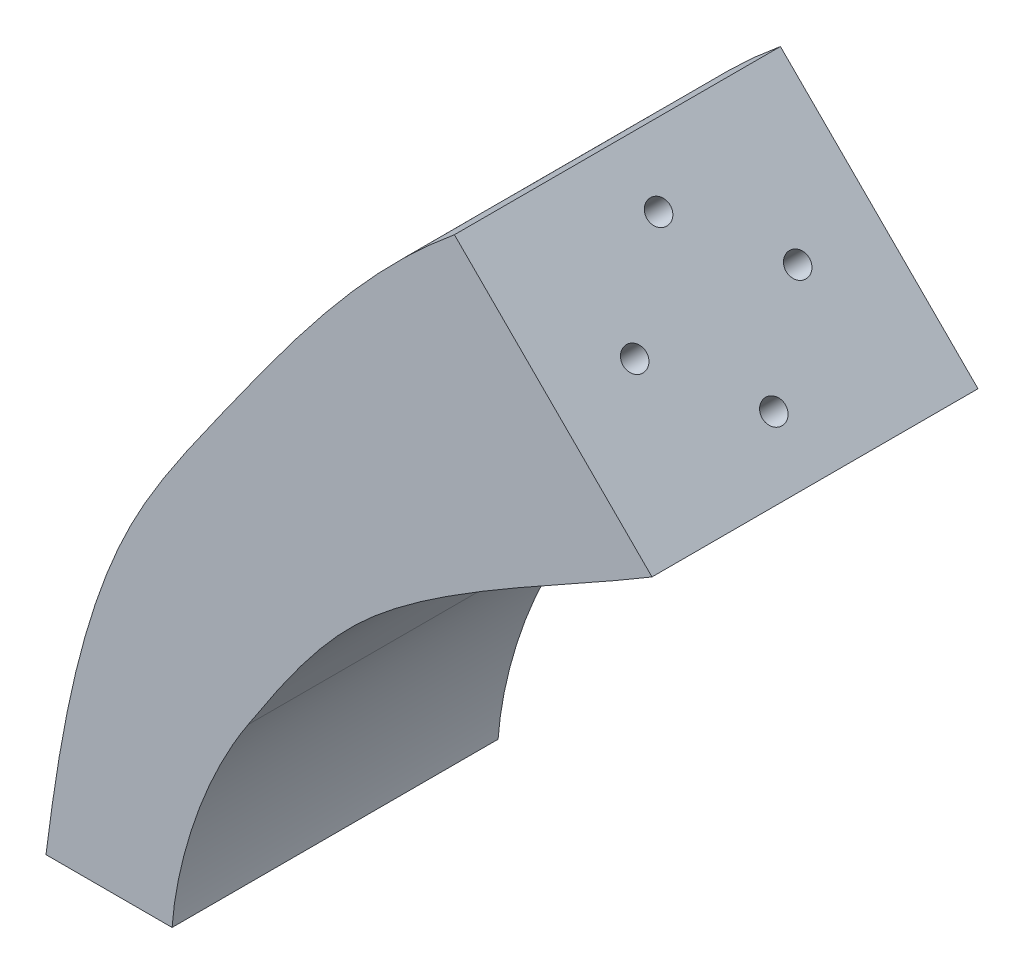
ISO-10303-21;
HEADER;
FILE_DESCRIPTION(('STEP AP214'),'2;1');
FILE_NAME('part.step','',(''),(''),'','','');
FILE_SCHEMA(('AUTOMOTIVE_DESIGN { 1 0 10303 214 1 1 1 1 }'));
ENDSEC;
DATA;
#1=APPLICATION_CONTEXT('core data for automotive mechanical design processes');
#2=APPLICATION_PROTOCOL_DEFINITION('international standard','automotive_design',2000,#1);
#3=PRODUCT_CONTEXT('',#1,'mechanical');
#4=PRODUCT('Part','Part','',(#3));
#5=PRODUCT_RELATED_PRODUCT_CATEGORY('part','',(#4));
#6=PRODUCT_DEFINITION_FORMATION('','',#4);
#7=PRODUCT_DEFINITION_CONTEXT('part definition',#1,'design');
#8=PRODUCT_DEFINITION('design','',#6,#7);
#9=PRODUCT_DEFINITION_SHAPE('','',#8);
#10=(LENGTH_UNIT() NAMED_UNIT(*) SI_UNIT(.MILLI.,.METRE.));
#11=(NAMED_UNIT(*) PLANE_ANGLE_UNIT() SI_UNIT($,.RADIAN.));
#12=(NAMED_UNIT(*) SI_UNIT($,.STERADIAN.) SOLID_ANGLE_UNIT());
#13=UNCERTAINTY_MEASURE_WITH_UNIT(LENGTH_MEASURE(1.E-05),#10,'distance_accuracy_value','');
#14=(GEOMETRIC_REPRESENTATION_CONTEXT(3) GLOBAL_UNCERTAINTY_ASSIGNED_CONTEXT((#13)) GLOBAL_UNIT_ASSIGNED_CONTEXT((#10,
#11,#12)) REPRESENTATION_CONTEXT('',''));
#15=CARTESIAN_POINT('',(0.,0.,0.));
#16=DIRECTION('',(0.,0.,1.));
#17=DIRECTION('',(1.,0.,0.));
#18=AXIS2_PLACEMENT_3D('',#15,#16,#17);
#19=CARTESIAN_POINT('',(2.0914275759303,20.6618620863459,28.));
#20=CARTESIAN_POINT('',(-6.15306444046798,13.9025645660014,28.));
#21=CARTESIAN_POINT('',(-14.885859474182,1.61416807354387,28.));
#22=CARTESIAN_POINT('',(-29.2947341902826,-18.7756846059916,28.));
#23=CARTESIAN_POINT('',(-31.7977961490312,-33.5362113340509,28.));
#24=CARTESIAN_POINT('',(-32.9878737184419,-42.9927690694143,28.));
#25=B_SPLINE_CURVE_WITH_KNOTS('',3,(#19,#20,#21,#22,#23,#24),.UNSPECIFIED.,.F.,.F.,(4,1,1,4),
(0.,0.424008196391717,0.607838577875477,1.),.UNSPECIFIED.);
#26=DIRECTION('',(0.,0.,-1.));
#27=VECTOR('',#26,1.);
#28=SURFACE_OF_LINEAR_EXTRUSION('',#25,#27);
#29=CARTESIAN_POINT('',(2.0914275759303,20.6618620863459,0.));
#30=CARTESIAN_POINT('',(-6.15306444046798,13.9025645660014,0.));
#31=CARTESIAN_POINT('',(-14.885859474182,1.61416807354387,0.));
#32=CARTESIAN_POINT('',(-29.2947341902826,-18.7756846059916,0.));
#33=CARTESIAN_POINT('',(-31.7977961490312,-33.5362113340509,0.));
#34=CARTESIAN_POINT('',(-32.9878737184419,-42.9927690694143,0.));
#35=B_SPLINE_CURVE_WITH_KNOTS('',3,(#29,#30,#31,#32,#33,#34),.UNSPECIFIED.,.F.,.F.,(4,1,1,4),
(0.,0.424008196391717,0.607838577875477,1.),.UNSPECIFIED.);
#36=CARTESIAN_POINT('',(2.0914275759303,20.6618620863459,0.));
#37=VERTEX_POINT('',#36);
#38=CARTESIAN_POINT('',(-32.9878737184419,-42.9927690694143,0.));
#39=VERTEX_POINT('',#38);
#40=EDGE_CURVE('E140',#37,#39,#35,.T.);
#41=ORIENTED_EDGE('',*,*,#40,.T.);
#42=DIRECTION('',(0.,0.,-1.));
#43=VECTOR('',#42,1.);
#44=CARTESIAN_POINT('',(-32.9878737184419,-42.9927690694143,28.));
#45=LINE('',#44,#43);
#46=CARTESIAN_POINT('',(-32.9878737184419,-42.9927690694143,28.));
#47=VERTEX_POINT('',#46);
#48=EDGE_CURVE('E11',#47,#39,#45,.T.);
#49=ORIENTED_EDGE('',*,*,#48,.F.);
#50=CARTESIAN_POINT('',(2.0914275759303,20.6618620863459,28.));
#51=VERTEX_POINT('',#50);
#52=EDGE_CURVE('E157',#51,#47,#25,.T.);
#53=ORIENTED_EDGE('',*,*,#52,.F.);
#54=DIRECTION('',(0.,0.,-1.));
#55=VECTOR('',#54,1.);
#56=CARTESIAN_POINT('',(2.0914275759303,20.6618620863459,28.));
#57=LINE('',#56,#55);
#58=EDGE_CURVE('E109',#51,#37,#57,.T.);
#59=ORIENTED_EDGE('',*,*,#58,.T.);
#60=EDGE_LOOP('',(#41,#49,#53,#59));
#61=FACE_BOUND('',#60,.T.);
#62=ADVANCED_FACE('F38',(#61),#28,.F.);
#63=CARTESIAN_POINT('',(-32.9878737184419,-42.9927690694143,28.));
#64=DIRECTION('',(0.,1.,0.));
#65=DIRECTION('',(0.,0.,1.));
#66=AXIS2_PLACEMENT_3D('',#63,#64,#65);
#67=PLANE('',#66);
#68=DIRECTION('',(1.,0.,0.));
#69=VECTOR('',#68,1.);
#70=CARTESIAN_POINT('',(-32.9878737184419,-42.9927690694143,0.));
#71=LINE('',#70,#69);
#72=CARTESIAN_POINT('',(-22.1582706144634,-42.9927690694143,0.));
#73=VERTEX_POINT('',#72);
#74=EDGE_CURVE('E135',#39,#73,#71,.T.);
#75=ORIENTED_EDGE('',*,*,#74,.T.);
#76=DIRECTION('',(0.,0.,-1.));
#77=VECTOR('',#76,1.);
#78=CARTESIAN_POINT('',(-22.1582706144634,-42.9927690694143,28.));
#79=LINE('',#78,#77);
#80=CARTESIAN_POINT('',(-22.1582706144634,-42.9927690694143,28.));
#81=VERTEX_POINT('',#80);
#82=EDGE_CURVE('E47',#81,#73,#79,.T.);
#83=ORIENTED_EDGE('',*,*,#82,.F.);
#84=DIRECTION('',(1.,0.,0.));
#85=VECTOR('',#84,1.);
#86=CARTESIAN_POINT('',(-32.9878737184419,-42.9927690694143,28.));
#87=LINE('',#86,#85);
#88=EDGE_CURVE('E89',#47,#81,#87,.T.);
#89=ORIENTED_EDGE('',*,*,#88,.F.);
#90=ORIENTED_EDGE('',*,*,#48,.T.);
#91=EDGE_LOOP('',(#75,#83,#89,#90));
#92=FACE_BOUND('',#91,.T.);
#93=ADVANCED_FACE('F129',(#92),#67,.F.);
#94=CARTESIAN_POINT('',(-22.1582706144634,-42.9927690694143,28.));
#95=CARTESIAN_POINT('',(-21.8926379827476,-38.9284275029792,28.));
#96=CARTESIAN_POINT('',(-20.1398252120298,-31.5111106028735,28.));
#97=CARTESIAN_POINT('',(-15.6286083684183,-24.6338973861882,28.));
#98=B_SPLINE_CURVE_WITH_KNOTS('',3,(#94,#95,#96,#97),.UNSPECIFIED.,.F.,.F.,(4,4),(0.,1.),.UNSPECIFIED.);
#99=DIRECTION('',(0.,0.,-1.));
#100=VECTOR('',#99,1.);
#101=SURFACE_OF_LINEAR_EXTRUSION('',#98,#100);
#102=CARTESIAN_POINT('',(-22.1582706144634,-42.9927690694143,0.));
#103=CARTESIAN_POINT('',(-21.8926379827476,-38.9284275029792,0.));
#104=CARTESIAN_POINT('',(-20.1398252120298,-31.5111106028735,0.));
#105=CARTESIAN_POINT('',(-15.6286083684183,-24.6338973861882,0.));
#106=B_SPLINE_CURVE_WITH_KNOTS('',3,(#102,#103,#104,#105),.UNSPECIFIED.,.F.,.F.,(4,4),(0.,1.),.UNSPECIFIED.);
#107=CARTESIAN_POINT('',(-15.6286083684183,-24.6338973861882,0.));
#108=VERTEX_POINT('',#107);
#109=EDGE_CURVE('E104',#73,#108,#106,.T.);
#110=ORIENTED_EDGE('',*,*,#109,.T.);
#111=DIRECTION('',(0.,0.,-1.));
#112=VECTOR('',#111,1.);
#113=CARTESIAN_POINT('',(-15.6286083684183,-24.6338973861882,28.));
#114=LINE('',#113,#112);
#115=CARTESIAN_POINT('',(-15.6286083684183,-24.6338973861882,28.));
#116=VERTEX_POINT('',#115);
#117=EDGE_CURVE('E101',#116,#108,#114,.T.);
#118=ORIENTED_EDGE('',*,*,#117,.F.);
#119=EDGE_CURVE('E93',#81,#116,#98,.T.);
#120=ORIENTED_EDGE('',*,*,#119,.F.);
#121=ORIENTED_EDGE('',*,*,#82,.T.);
#122=EDGE_LOOP('',(#110,#118,#120,#121));
#123=FACE_BOUND('',#122,.T.);
#124=ADVANCED_FACE('F102',(#123),#101,.F.);
#125=CARTESIAN_POINT('',(-15.6286083684183,-24.6338973861882,28.));
#126=CARTESIAN_POINT('',(-12.8794852080453,-20.3951454847549,28.));
#127=CARTESIAN_POINT('',(-8.47274620097499,-13.7663385414123,28.));
#128=CARTESIAN_POINT('',(3.69005220384696,-4.5560228109252,28.));
#129=CARTESIAN_POINT('',(12.7462164724073,-0.109381504325811,28.));
#130=CARTESIAN_POINT('',(19.0619903244077,3.69129933786898,28.));
#131=B_SPLINE_CURVE_WITH_KNOTS('',3,(#125,#126,#127,#128,#129,#130),.UNSPECIFIED.,.F.,.F.,(4,1,
1,4),(0.,0.336463063865419,0.513647948280567,1.),.UNSPECIFIED.);
#132=DIRECTION('',(0.,0.,-1.));
#133=VECTOR('',#132,1.);
#134=SURFACE_OF_LINEAR_EXTRUSION('',#131,#133);
#135=CARTESIAN_POINT('',(-15.6286083684183,-24.6338973861882,0.));
#136=CARTESIAN_POINT('',(-12.8794852080453,-20.3951454847549,0.));
#137=CARTESIAN_POINT('',(-8.47274620097499,-13.7663385414123,0.));
#138=CARTESIAN_POINT('',(3.69005220384696,-4.5560228109252,0.));
#139=CARTESIAN_POINT('',(12.7462164724073,-0.109381504325811,0.));
#140=CARTESIAN_POINT('',(19.0619903244077,3.69129933786898,0.));
#141=B_SPLINE_CURVE_WITH_KNOTS('',3,(#135,#136,#137,#138,#139,#140),.UNSPECIFIED.,.F.,.F.,(4,1,
1,4),(0.,0.336463063865419,0.513647948280567,1.),.UNSPECIFIED.);
#142=CARTESIAN_POINT('',(19.0619903244077,3.69129933786898,0.));
#143=VERTEX_POINT('',#142);
#144=EDGE_CURVE('E75',#108,#143,#141,.T.);
#145=ORIENTED_EDGE('',*,*,#144,.T.);
#146=DIRECTION('',(0.,0.,-1.));
#147=VECTOR('',#146,1.);
#148=CARTESIAN_POINT('',(19.0619903244077,3.69129933786898,28.));
#149=LINE('',#148,#147);
#150=CARTESIAN_POINT('',(19.0619903244077,3.69129933786898,28.));
#151=VERTEX_POINT('',#150);
#152=EDGE_CURVE('E105',#151,#143,#149,.T.);
#153=ORIENTED_EDGE('',*,*,#152,.F.);
#154=EDGE_CURVE('E97',#116,#151,#131,.T.);
#155=ORIENTED_EDGE('',*,*,#154,.F.);
#156=ORIENTED_EDGE('',*,*,#117,.T.);
#157=EDGE_LOOP('',(#145,#153,#155,#156));
#158=FACE_BOUND('',#157,.T.);
#159=ADVANCED_FACE('F107',(#158),#134,.F.);
#160=CARTESIAN_POINT('',(2.0914275759303,20.6618620863459,28.));
#161=DIRECTION('',(-0.707106781186539,-0.707106781186556,0.));
#162=DIRECTION('',(0.707106781186556,-0.707106781186539,0.));
#163=AXIS2_PLACEMENT_3D('',#160,#161,#162);
#164=PLANE('',#163);
#165=CARTESIAN_POINT('',(10.576708950169,12.1765807121074,7.));
#166=DIRECTION('',(0.707106781186539,0.707106781186556,0.));
#167=DIRECTION('',(-0.707106781186556,0.707106781186539,0.));
#168=AXIS2_PLACEMENT_3D('',#165,#166,#167);
#169=CIRCLE('',#168,0.999999999999999);
#170=CARTESIAN_POINT('',(9.86960216898242,12.883687493294,7.));
#171=VERTEX_POINT('',#170);
#172=EDGE_CURVE('E161',#171,#171,#169,.T.);
#173=ORIENTED_EDGE('',*,*,#172,.F.);
#174=EDGE_LOOP('',(#173));
#175=FACE_BOUND('',#174,.T.);
#176=CARTESIAN_POINT('',(5.62696148186308,17.1263281804132,14.));
#177=DIRECTION('',(0.707106781186539,0.707106781186556,0.));
#178=DIRECTION('',(0.707106781186556,-0.707106781186539,0.));
#179=AXIS2_PLACEMENT_3D('',#176,#177,#178);
#180=CIRCLE('',#179,0.999999999999999);
#181=CARTESIAN_POINT('',(6.33406826304963,16.4192213992267,14.));
#182=VERTEX_POINT('',#181);
#183=EDGE_CURVE('E178',#182,#182,#180,.T.);
#184=ORIENTED_EDGE('',*,*,#183,.F.);
#185=EDGE_LOOP('',(#184));
#186=FACE_BOUND('',#185,.T.);
#187=CARTESIAN_POINT('',(15.5264564184749,7.22683324380167,14.));
#188=DIRECTION('',(0.707106781186539,0.707106781186556,0.));
#189=DIRECTION('',(-0.707106781186556,0.707106781186539,0.));
#190=AXIS2_PLACEMENT_3D('',#187,#188,#189);
#191=CIRCLE('',#190,1.);
#192=CARTESIAN_POINT('',(14.8193496372883,7.93394002498821,14.));
#193=VERTEX_POINT('',#192);
#194=EDGE_CURVE('E177',#193,#193,#191,.T.);
#195=ORIENTED_EDGE('',*,*,#194,.F.);
#196=EDGE_LOOP('',(#195));
#197=FACE_BOUND('',#196,.T.);
#198=CARTESIAN_POINT('',(10.576708950169,12.1765807121074,21.));
#199=DIRECTION('',(0.707106781186539,0.707106781186556,0.));
#200=DIRECTION('',(0.707106781186556,-0.707106781186539,0.));
#201=AXIS2_PLACEMENT_3D('',#198,#199,#200);
#202=CIRCLE('',#201,1.);
#203=CARTESIAN_POINT('',(11.2838157313555,11.4694739309209,21.));
#204=VERTEX_POINT('',#203);
#205=EDGE_CURVE('E183',#204,#204,#202,.T.);
#206=ORIENTED_EDGE('',*,*,#205,.F.);
#207=EDGE_LOOP('',(#206));
#208=FACE_BOUND('',#207,.T.);
#209=DIRECTION('',(-0.707106781186556,0.707106781186539,0.));
#210=VECTOR('',#209,1.);
#211=CARTESIAN_POINT('',(2.0914275759303,20.6618620863459,0.));
#212=LINE('',#211,#210);
#213=EDGE_CURVE('E81',#143,#37,#212,.T.);
#214=ORIENTED_EDGE('',*,*,#213,.T.);
#215=ORIENTED_EDGE('',*,*,#58,.F.);
#216=DIRECTION('',(-0.707106781186556,0.707106781186539,0.));
#217=VECTOR('',#216,1.);
#218=CARTESIAN_POINT('',(2.0914275759303,20.6618620863459,28.));
#219=LINE('',#218,#217);
#220=EDGE_CURVE('E55',#151,#51,#219,.T.);
#221=ORIENTED_EDGE('',*,*,#220,.F.);
#222=ORIENTED_EDGE('',*,*,#152,.T.);
#223=EDGE_LOOP('',(#214,#215,#221,#222));
#224=FACE_BOUND('',#223,.T.);
#225=ADVANCED_FACE('F126',(#175,#186,#197,#208,#224),#164,.F.);
#226=CARTESIAN_POINT('',(-21.590184537221,-7.9550543840526,28.));
#227=DIRECTION('',(0.,0.,-1.));
#228=DIRECTION('',(-1.,0.,0.));
#229=AXIS2_PLACEMENT_3D('',#226,#227,#228);
#230=PLANE('',#229);
#231=ORIENTED_EDGE('',*,*,#52,.T.);
#232=ORIENTED_EDGE('',*,*,#88,.T.);
#233=ORIENTED_EDGE('',*,*,#119,.T.);
#234=ORIENTED_EDGE('',*,*,#154,.T.);
#235=ORIENTED_EDGE('',*,*,#220,.T.);
#236=EDGE_LOOP('',(#231,#232,#233,#234,#235));
#237=FACE_BOUND('',#236,.T.);
#238=ADVANCED_FACE('F95',(#237),#230,.F.);
#239=CARTESIAN_POINT('',(-21.590184537221,-7.9550543840526,0.));
#240=DIRECTION('',(0.,0.,-1.));
#241=DIRECTION('',(-1.,0.,0.));
#242=AXIS2_PLACEMENT_3D('',#239,#240,#241);
#243=PLANE('',#242);
#244=ORIENTED_EDGE('',*,*,#40,.F.);
#245=ORIENTED_EDGE('',*,*,#213,.F.);
#246=ORIENTED_EDGE('',*,*,#144,.F.);
#247=ORIENTED_EDGE('',*,*,#109,.F.);
#248=ORIENTED_EDGE('',*,*,#74,.F.);
#249=EDGE_LOOP('',(#244,#245,#246,#247,#248));
#250=FACE_BOUND('',#249,.T.);
#251=ADVANCED_FACE('F142',(#250),#243,.T.);
#252=CARTESIAN_POINT('',(4.91985470067666,6.519726462615,21.));
#253=DIRECTION('',(0.707106781186539,0.707106781186556,0.));
#254=DIRECTION('',(-0.707106781186556,0.707106781186539,0.));
#255=AXIS2_PLACEMENT_3D('',#252,#253,#254);
#256=CYLINDRICAL_SURFACE('',#255,1.);
#257=CARTESIAN_POINT('',(4.91985470067666,6.519726462615,21.));
#258=DIRECTION('',(0.707106781186539,0.707106781186556,0.));
#259=DIRECTION('',(0.707106781186556,-0.707106781186539,0.));
#260=AXIS2_PLACEMENT_3D('',#257,#258,#259);
#261=CIRCLE('',#260,1.);
#262=CARTESIAN_POINT('',(5.62696148186322,5.81261968142846,21.));
#263=VERTEX_POINT('',#262);
#264=EDGE_CURVE('E171',#263,#263,#261,.T.);
#265=ORIENTED_EDGE('',*,*,#264,.F.);
#266=EDGE_LOOP('',(#265));
#267=FACE_BOUND('',#266,.T.);
#268=ORIENTED_EDGE('',*,*,#205,.T.);
#269=EDGE_LOOP('',(#268));
#270=FACE_BOUND('',#269,.T.);
#271=ADVANCED_FACE('F206',(#267,#270),#256,.F.);
#272=CARTESIAN_POINT('',(4.91985470067666,6.519726462615,21.));
#273=DIRECTION('',(-0.707106781186539,-0.707106781186556,0.));
#274=DIRECTION('',(0.707106781186556,-0.707106781186539,0.));
#275=AXIS2_PLACEMENT_3D('',#272,#273,#274);
#276=PLANE('',#275);
#277=ORIENTED_EDGE('',*,*,#264,.T.);
#278=EDGE_LOOP('',(#277));
#279=FACE_BOUND('',#278,.T.);
#280=ADVANCED_FACE('F208',(#279),#276,.F.);
#281=CARTESIAN_POINT('',(9.86960216898256,1.56997899430922,14.));
#282=DIRECTION('',(0.707106781186539,0.707106781186556,0.));
#283=DIRECTION('',(-0.707106781186556,0.707106781186539,0.));
#284=AXIS2_PLACEMENT_3D('',#281,#282,#283);
#285=CYLINDRICAL_SURFACE('',#284,1.);
#286=CARTESIAN_POINT('',(9.86960216898256,1.56997899430922,14.));
#287=DIRECTION('',(0.707106781186539,0.707106781186556,0.));
#288=DIRECTION('',(-0.707106781186556,0.707106781186539,0.));
#289=AXIS2_PLACEMENT_3D('',#286,#287,#288);
#290=CIRCLE('',#289,1.);
#291=CARTESIAN_POINT('',(9.162495387796,2.27708577549576,14.));
#292=VERTEX_POINT('',#291);
#293=EDGE_CURVE('E186',#292,#292,#290,.T.);
#294=ORIENTED_EDGE('',*,*,#293,.F.);
#295=EDGE_LOOP('',(#294));
#296=FACE_BOUND('',#295,.T.);
#297=ORIENTED_EDGE('',*,*,#194,.T.);
#298=EDGE_LOOP('',(#297));
#299=FACE_BOUND('',#298,.T.);
#300=ADVANCED_FACE('F199',(#296,#299),#285,.F.);
#301=CARTESIAN_POINT('',(9.86960216898256,1.56997899430922,14.));
#302=DIRECTION('',(0.707106781186539,0.707106781186556,0.));
#303=DIRECTION('',(-0.707106781186556,0.707106781186539,0.));
#304=AXIS2_PLACEMENT_3D('',#301,#302,#303);
#305=PLANE('',#304);
#306=ORIENTED_EDGE('',*,*,#293,.T.);
#307=EDGE_LOOP('',(#306));
#308=FACE_BOUND('',#307,.T.);
#309=ADVANCED_FACE('F220',(#308),#305,.T.);
#310=CARTESIAN_POINT('',(-0.0298927676292311,11.4694739309208,14.));
#311=DIRECTION('',(0.707106781186539,0.707106781186556,0.));
#312=DIRECTION('',(-0.707106781186556,0.707106781186539,0.));
#313=AXIS2_PLACEMENT_3D('',#310,#311,#312);
#314=CYLINDRICAL_SURFACE('',#313,0.999999999999999);
#315=CARTESIAN_POINT('',(-0.0298927676292311,11.4694739309208,14.));
#316=DIRECTION('',(0.707106781186539,0.707106781186556,0.));
#317=DIRECTION('',(0.707106781186556,-0.707106781186539,0.));
#318=AXIS2_PLACEMENT_3D('',#315,#316,#317);
#319=CIRCLE('',#318,0.999999999999999);
#320=CARTESIAN_POINT('',(0.677214013557325,10.7623671497342,14.));
#321=VERTEX_POINT('',#320);
#322=EDGE_CURVE('E174',#321,#321,#319,.T.);
#323=ORIENTED_EDGE('',*,*,#322,.F.);
#324=EDGE_LOOP('',(#323));
#325=FACE_BOUND('',#324,.T.);
#326=ORIENTED_EDGE('',*,*,#183,.T.);
#327=EDGE_LOOP('',(#326));
#328=FACE_BOUND('',#327,.T.);
#329=ADVANCED_FACE('F223',(#325,#328),#314,.F.);
#330=CARTESIAN_POINT('',(-0.0298927676292311,11.4694739309208,14.));
#331=DIRECTION('',(-0.707106781186539,-0.707106781186556,0.));
#332=DIRECTION('',(0.707106781186556,-0.707106781186539,0.));
#333=AXIS2_PLACEMENT_3D('',#330,#331,#332);
#334=PLANE('',#333);
#335=ORIENTED_EDGE('',*,*,#322,.T.);
#336=EDGE_LOOP('',(#335));
#337=FACE_BOUND('',#336,.T.);
#338=ADVANCED_FACE('F276',(#337),#334,.F.);
#339=CARTESIAN_POINT('',(4.91985470067666,6.519726462615,7.));
#340=DIRECTION('',(0.707106781186539,0.707106781186556,0.));
#341=DIRECTION('',(-0.707106781186556,0.707106781186539,0.));
#342=AXIS2_PLACEMENT_3D('',#339,#340,#341);
#343=CYLINDRICAL_SURFACE('',#342,0.999999999999999);
#344=CARTESIAN_POINT('',(4.91985470067666,6.519726462615,7.));
#345=DIRECTION('',(0.707106781186539,0.707106781186556,0.));
#346=DIRECTION('',(-0.707106781186556,0.707106781186539,0.));
#347=AXIS2_PLACEMENT_3D('',#344,#345,#346);
#348=CIRCLE('',#347,0.999999999999999);
#349=CARTESIAN_POINT('',(4.21274791949011,7.22683324380154,7.));
#350=VERTEX_POINT('',#349);
#351=EDGE_CURVE('E159',#350,#350,#348,.T.);
#352=ORIENTED_EDGE('',*,*,#351,.F.);
#353=EDGE_LOOP('',(#352));
#354=FACE_BOUND('',#353,.T.);
#355=ORIENTED_EDGE('',*,*,#172,.T.);
#356=EDGE_LOOP('',(#355));
#357=FACE_BOUND('',#356,.T.);
#358=ADVANCED_FACE('F285',(#354,#357),#343,.F.);
#359=CARTESIAN_POINT('',(4.91985470067666,6.519726462615,7.));
#360=DIRECTION('',(0.707106781186539,0.707106781186556,0.));
#361=DIRECTION('',(-0.707106781186556,0.707106781186539,0.));
#362=AXIS2_PLACEMENT_3D('',#359,#360,#361);
#363=PLANE('',#362);
#364=ORIENTED_EDGE('',*,*,#351,.T.);
#365=EDGE_LOOP('',(#364));
#366=FACE_BOUND('',#365,.T.);
#367=ADVANCED_FACE('F295',(#366),#363,.T.);
#368=CLOSED_SHELL('',(#62,#93,#124,#159,#225,#238,#251,#271,#280,#300,#309,#329,#338,#358,#367));
#369=MANIFOLD_SOLID_BREP('B2',#368);
#370=ADVANCED_BREP_SHAPE_REPRESENTATION('',(#18,#369),#14);
#371=SHAPE_DEFINITION_REPRESENTATION(#9,#370);
ENDSEC;
END-ISO-10303-21;
